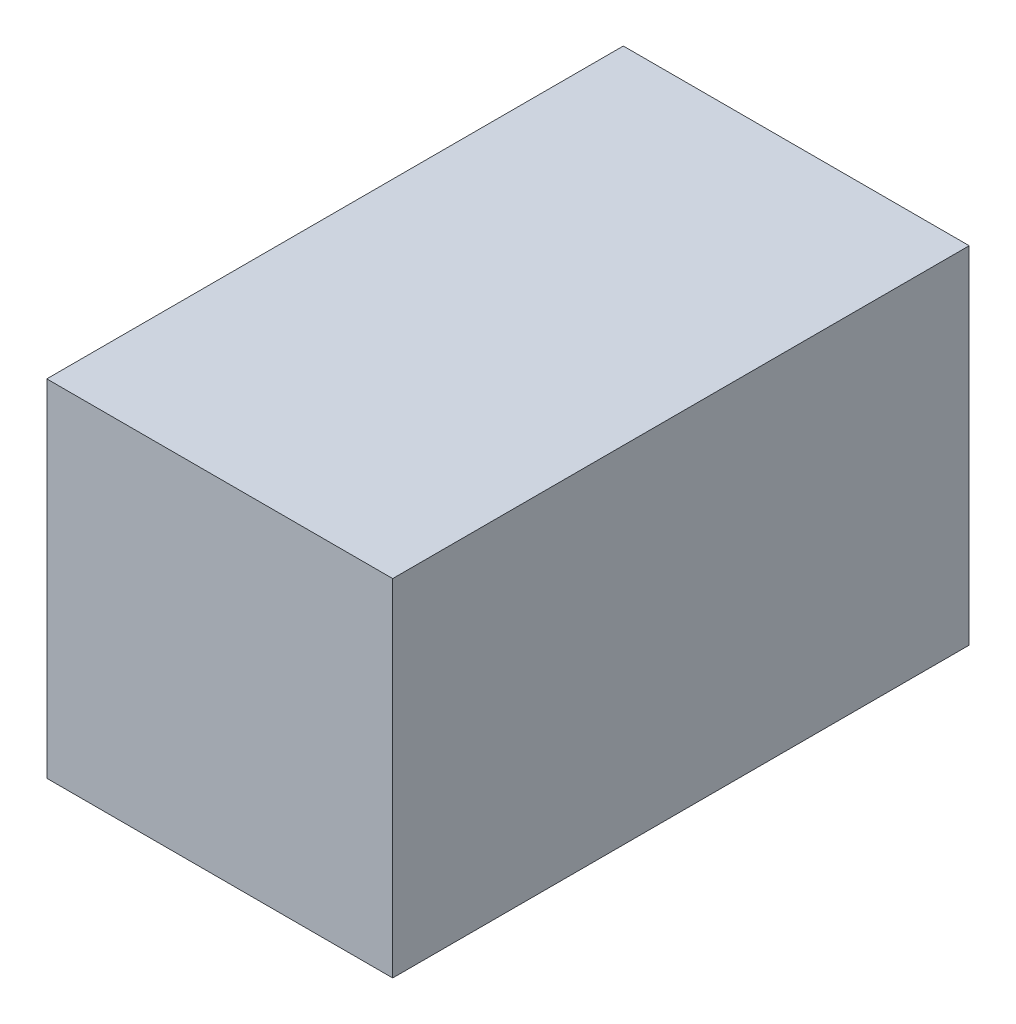
ISO-10303-21;
HEADER;
FILE_DESCRIPTION(('STEP AP214'),'2;1');
FILE_NAME('part.step','',(''),(''),'','','');
FILE_SCHEMA(('AUTOMOTIVE_DESIGN { 1 0 10303 214 1 1 1 1 }'));
ENDSEC;
DATA;
#1=APPLICATION_CONTEXT('core data for automotive mechanical design processes');
#2=APPLICATION_PROTOCOL_DEFINITION('international standard','automotive_design',2000,#1);
#3=PRODUCT_CONTEXT('',#1,'mechanical');
#4=PRODUCT('Part','Part','',(#3));
#5=PRODUCT_RELATED_PRODUCT_CATEGORY('part','',(#4));
#6=PRODUCT_DEFINITION_FORMATION('','',#4);
#7=PRODUCT_DEFINITION_CONTEXT('part definition',#1,'design');
#8=PRODUCT_DEFINITION('design','',#6,#7);
#9=PRODUCT_DEFINITION_SHAPE('','',#8);
#10=(LENGTH_UNIT() NAMED_UNIT(*) SI_UNIT(.MILLI.,.METRE.));
#11=(NAMED_UNIT(*) PLANE_ANGLE_UNIT() SI_UNIT($,.RADIAN.));
#12=(NAMED_UNIT(*) SI_UNIT($,.STERADIAN.) SOLID_ANGLE_UNIT());
#13=UNCERTAINTY_MEASURE_WITH_UNIT(LENGTH_MEASURE(1.E-05),#10,'distance_accuracy_value','');
#14=(GEOMETRIC_REPRESENTATION_CONTEXT(3) GLOBAL_UNCERTAINTY_ASSIGNED_CONTEXT((#13)) GLOBAL_UNIT_ASSIGNED_CONTEXT((#10,
#11,#12)) REPRESENTATION_CONTEXT('',''));
#15=CARTESIAN_POINT('',(0.,0.,0.));
#16=DIRECTION('',(0.,0.,1.));
#17=DIRECTION('',(1.,0.,0.));
#18=AXIS2_PLACEMENT_3D('',#15,#16,#17);
#19=CARTESIAN_POINT('',(-7.5,-7.5,25.));
#20=DIRECTION('',(1.,0.,0.));
#21=DIRECTION('',(0.,0.,-1.));
#22=AXIS2_PLACEMENT_3D('',#19,#20,#21);
#23=PLANE('',#22);
#24=DIRECTION('',(0.,-1.,0.));
#25=VECTOR('',#24,1.);
#26=CARTESIAN_POINT('',(-7.5,-7.5,0.));
#27=LINE('',#26,#25);
#28=CARTESIAN_POINT('',(-7.5,7.5,0.));
#29=VERTEX_POINT('',#28);
#30=CARTESIAN_POINT('',(-7.5,-7.5,0.));
#31=VERTEX_POINT('',#30);
#32=EDGE_CURVE('E107',#29,#31,#27,.T.);
#33=ORIENTED_EDGE('',*,*,#32,.T.);
#34=DIRECTION('',(0.,0.,-1.));
#35=VECTOR('',#34,1.);
#36=CARTESIAN_POINT('',(-7.5,-7.5,25.));
#37=LINE('',#36,#35);
#38=CARTESIAN_POINT('',(-7.5,-7.5,25.));
#39=VERTEX_POINT('',#38);
#40=EDGE_CURVE('E11',#39,#31,#37,.T.);
#41=ORIENTED_EDGE('',*,*,#40,.F.);
#42=DIRECTION('',(0.,-1.,0.));
#43=VECTOR('',#42,1.);
#44=CARTESIAN_POINT('',(-7.5,-7.5,25.));
#45=LINE('',#44,#43);
#46=CARTESIAN_POINT('',(-7.5,7.5,25.));
#47=VERTEX_POINT('',#46);
#48=EDGE_CURVE('E91',#47,#39,#45,.T.);
#49=ORIENTED_EDGE('',*,*,#48,.F.);
#50=DIRECTION('',(0.,0.,-1.));
#51=VECTOR('',#50,1.);
#52=CARTESIAN_POINT('',(-7.5,7.5,25.));
#53=LINE('',#52,#51);
#54=EDGE_CURVE('E103',#47,#29,#53,.T.);
#55=ORIENTED_EDGE('',*,*,#54,.T.);
#56=EDGE_LOOP('',(#33,#41,#49,#55));
#57=FACE_BOUND('',#56,.T.);
#58=ADVANCED_FACE('F39',(#57),#23,.F.);
#59=CARTESIAN_POINT('',(7.5,-7.5,25.));
#60=DIRECTION('',(0.,1.,0.));
#61=DIRECTION('',(-1.,0.,0.));
#62=AXIS2_PLACEMENT_3D('',#59,#60,#61);
#63=PLANE('',#62);
#64=DIRECTION('',(1.,0.,0.));
#65=VECTOR('',#64,1.);
#66=CARTESIAN_POINT('',(7.5,-7.5,0.));
#67=LINE('',#66,#65);
#68=CARTESIAN_POINT('',(7.5,-7.5,0.));
#69=VERTEX_POINT('',#68);
#70=EDGE_CURVE('E96',#31,#69,#67,.T.);
#71=ORIENTED_EDGE('',*,*,#70,.T.);
#72=DIRECTION('',(0.,0.,-1.));
#73=VECTOR('',#72,1.);
#74=CARTESIAN_POINT('',(7.5,-7.5,25.));
#75=LINE('',#74,#73);
#76=CARTESIAN_POINT('',(7.5,-7.5,25.));
#77=VERTEX_POINT('',#76);
#78=EDGE_CURVE('E48',#77,#69,#75,.T.);
#79=ORIENTED_EDGE('',*,*,#78,.F.);
#80=DIRECTION('',(1.,0.,0.));
#81=VECTOR('',#80,1.);
#82=CARTESIAN_POINT('',(7.5,-7.5,25.));
#83=LINE('',#82,#81);
#84=EDGE_CURVE('E86',#39,#77,#83,.T.);
#85=ORIENTED_EDGE('',*,*,#84,.F.);
#86=ORIENTED_EDGE('',*,*,#40,.T.);
#87=EDGE_LOOP('',(#71,#79,#85,#86));
#88=FACE_BOUND('',#87,.T.);
#89=ADVANCED_FACE('F95',(#88),#63,.F.);
#90=CARTESIAN_POINT('',(7.5,-7.5,25.));
#91=DIRECTION('',(-1.,0.,0.));
#92=DIRECTION('',(0.,0.,1.));
#93=AXIS2_PLACEMENT_3D('',#90,#91,#92);
#94=PLANE('',#93);
#95=DIRECTION('',(0.,1.,0.));
#96=VECTOR('',#95,1.);
#97=CARTESIAN_POINT('',(7.5,-7.5,0.));
#98=LINE('',#97,#96);
#99=CARTESIAN_POINT('',(7.5,7.5,0.));
#100=VERTEX_POINT('',#99);
#101=EDGE_CURVE('E73',#69,#100,#98,.T.);
#102=ORIENTED_EDGE('',*,*,#101,.T.);
#103=DIRECTION('',(0.,0.,-1.));
#104=VECTOR('',#103,1.);
#105=CARTESIAN_POINT('',(7.5,7.5,25.));
#106=LINE('',#105,#104);
#107=CARTESIAN_POINT('',(7.5,7.5,25.));
#108=VERTEX_POINT('',#107);
#109=EDGE_CURVE('E98',#108,#100,#106,.T.);
#110=ORIENTED_EDGE('',*,*,#109,.F.);
#111=DIRECTION('',(0.,1.,0.));
#112=VECTOR('',#111,1.);
#113=CARTESIAN_POINT('',(7.5,-7.5,25.));
#114=LINE('',#113,#112);
#115=EDGE_CURVE('E89',#77,#108,#114,.T.);
#116=ORIENTED_EDGE('',*,*,#115,.F.);
#117=ORIENTED_EDGE('',*,*,#78,.T.);
#118=EDGE_LOOP('',(#102,#110,#116,#117));
#119=FACE_BOUND('',#118,.T.);
#120=ADVANCED_FACE('F99',(#119),#94,.F.);
#121=CARTESIAN_POINT('',(7.5,7.5,25.));
#122=DIRECTION('',(0.,-1.,0.));
#123=DIRECTION('',(1.,0.,0.));
#124=AXIS2_PLACEMENT_3D('',#121,#122,#123);
#125=PLANE('',#124);
#126=DIRECTION('',(-1.,0.,0.));
#127=VECTOR('',#126,1.);
#128=CARTESIAN_POINT('',(7.5,7.5,0.));
#129=LINE('',#128,#127);
#130=EDGE_CURVE('E79',#100,#29,#129,.T.);
#131=ORIENTED_EDGE('',*,*,#130,.T.);
#132=ORIENTED_EDGE('',*,*,#54,.F.);
#133=DIRECTION('',(-1.,0.,0.));
#134=VECTOR('',#133,1.);
#135=CARTESIAN_POINT('',(7.5,7.5,25.));
#136=LINE('',#135,#134);
#137=EDGE_CURVE('E56',#108,#47,#136,.T.);
#138=ORIENTED_EDGE('',*,*,#137,.F.);
#139=ORIENTED_EDGE('',*,*,#109,.T.);
#140=EDGE_LOOP('',(#131,#132,#138,#139));
#141=FACE_BOUND('',#140,.T.);
#142=ADVANCED_FACE('F120',(#141),#125,.F.);
#143=CARTESIAN_POINT('',(0.,0.,25.));
#144=DIRECTION('',(0.,0.,1.));
#145=DIRECTION('',(1.,0.,0.));
#146=AXIS2_PLACEMENT_3D('',#143,#144,#145);
#147=PLANE('',#146);
#148=ORIENTED_EDGE('',*,*,#48,.T.);
#149=ORIENTED_EDGE('',*,*,#84,.T.);
#150=ORIENTED_EDGE('',*,*,#115,.T.);
#151=ORIENTED_EDGE('',*,*,#137,.T.);
#152=EDGE_LOOP('',(#148,#149,#150,#151));
#153=FACE_BOUND('',#152,.T.);
#154=ADVANCED_FACE('F87',(#153),#147,.T.);
#155=CARTESIAN_POINT('',(0.,0.,0.));
#156=DIRECTION('',(0.,0.,1.));
#157=DIRECTION('',(1.,0.,0.));
#158=AXIS2_PLACEMENT_3D('',#155,#156,#157);
#159=PLANE('',#158);
#160=ORIENTED_EDGE('',*,*,#32,.F.);
#161=ORIENTED_EDGE('',*,*,#130,.F.);
#162=ORIENTED_EDGE('',*,*,#101,.F.);
#163=ORIENTED_EDGE('',*,*,#70,.F.);
#164=EDGE_LOOP('',(#160,#161,#162,#163));
#165=FACE_BOUND('',#164,.T.);
#166=ADVANCED_FACE('F123',(#165),#159,.F.);
#167=CLOSED_SHELL('',(#58,#89,#120,#142,#154,#166));
#168=MANIFOLD_SOLID_BREP('B2',#167);
#169=ADVANCED_BREP_SHAPE_REPRESENTATION('',(#18,#168),#14);
#170=SHAPE_DEFINITION_REPRESENTATION(#9,#169);
ENDSEC;
END-ISO-10303-21;
